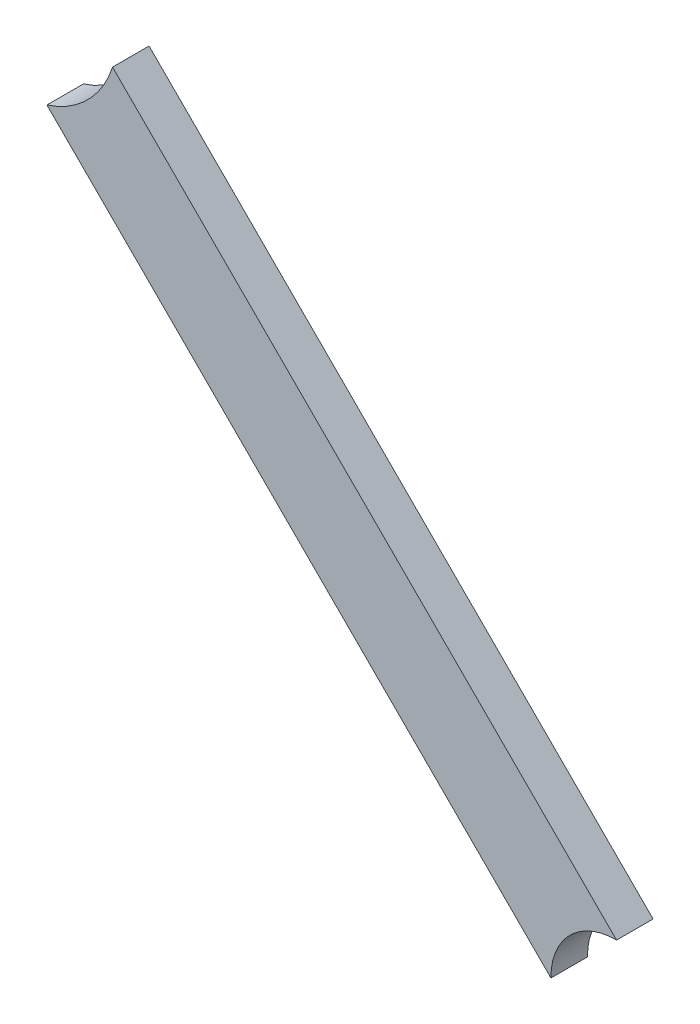
ISO-10303-21;
HEADER;
FILE_DESCRIPTION(('STEP AP214'),'2;1');
FILE_NAME('part.step','',(''),(''),'','','');
FILE_SCHEMA(('AUTOMOTIVE_DESIGN { 1 0 10303 214 1 1 1 1 }'));
ENDSEC;
DATA;
#1=APPLICATION_CONTEXT('core data for automotive mechanical design processes');
#2=APPLICATION_PROTOCOL_DEFINITION('international standard','automotive_design',2000,#1);
#3=PRODUCT_CONTEXT('',#1,'mechanical');
#4=PRODUCT('Part','Part','',(#3));
#5=PRODUCT_RELATED_PRODUCT_CATEGORY('part','',(#4));
#6=PRODUCT_DEFINITION_FORMATION('','',#4);
#7=PRODUCT_DEFINITION_CONTEXT('part definition',#1,'design');
#8=PRODUCT_DEFINITION('design','',#6,#7);
#9=PRODUCT_DEFINITION_SHAPE('','',#8);
#10=(LENGTH_UNIT() NAMED_UNIT(*) SI_UNIT(.MILLI.,.METRE.));
#11=(NAMED_UNIT(*) PLANE_ANGLE_UNIT() SI_UNIT($,.RADIAN.));
#12=(NAMED_UNIT(*) SI_UNIT($,.STERADIAN.) SOLID_ANGLE_UNIT());
#13=UNCERTAINTY_MEASURE_WITH_UNIT(LENGTH_MEASURE(1.E-05),#10,'distance_accuracy_value','');
#14=(GEOMETRIC_REPRESENTATION_CONTEXT(3) GLOBAL_UNCERTAINTY_ASSIGNED_CONTEXT((#13)) GLOBAL_UNIT_ASSIGNED_CONTEXT((#10,
#11,#12)) REPRESENTATION_CONTEXT('',''));
#15=CARTESIAN_POINT('',(0.,0.,0.));
#16=DIRECTION('',(0.,0.,1.));
#17=DIRECTION('',(1.,0.,0.));
#18=AXIS2_PLACEMENT_3D('',#15,#16,#17);
#19=CARTESIAN_POINT('',(113.954062741144,100.690460978856,0.));
#20=DIRECTION('',(0.707106781186549,0.707106781186546,0.));
#21=DIRECTION('',(0.707106781186546,-0.707106781186549,0.));
#22=AXIS2_PLACEMENT_3D('',#19,#20,#21);
#23=PLANE('',#22);
#24=DIRECTION('',(0.707106781186546,-0.707106781186549,0.));
#25=VECTOR('',#24,1.);
#26=CARTESIAN_POINT('',(113.60512966,101.03939406,0.1999996));
#27=LINE('',#26,#25);
#28=CARTESIAN_POINT('',(113.954062741144,100.690460978856,0.1999996));
#29=VERTEX_POINT('',#28);
#30=CARTESIAN_POINT('',(116.713018532393,97.9315051876074,0.1999996));
#31=VERTEX_POINT('',#30);
#32=EDGE_CURVE('E11',#29,#31,#27,.T.);
#33=ORIENTED_EDGE('',*,*,#32,.F.);
#34=DIRECTION('',(0.,0.,1.));
#35=VECTOR('',#34,1.);
#36=CARTESIAN_POINT('',(113.954062741144,100.690460978856,0.));
#37=LINE('',#36,#35);
#38=CARTESIAN_POINT('',(113.954062741144,100.690460978856,0.));
#39=VERTEX_POINT('',#38);
#40=EDGE_CURVE('E24',#39,#29,#37,.T.);
#41=ORIENTED_EDGE('',*,*,#40,.F.);
#42=DIRECTION('',(0.707106781186546,-0.707106781186549,0.));
#43=VECTOR('',#42,1.);
#44=CARTESIAN_POINT('',(113.60512966,101.03939406,0.));
#45=LINE('',#44,#43);
#46=CARTESIAN_POINT('',(116.713018532393,97.9315051876074,0.));
#47=VERTEX_POINT('',#46);
#48=EDGE_CURVE('E75',#39,#47,#45,.T.);
#49=ORIENTED_EDGE('',*,*,#48,.T.);
#50=DIRECTION('',(0.,0.,1.));
#51=VECTOR('',#50,1.);
#52=CARTESIAN_POINT('',(116.713018532393,97.9315051876074,0.));
#53=LINE('',#52,#51);
#54=EDGE_CURVE('E37',#47,#31,#53,.T.);
#55=ORIENTED_EDGE('',*,*,#54,.T.);
#56=EDGE_LOOP('',(#33,#41,#49,#55));
#57=FACE_BOUND('',#56,.T.);
#58=ADVANCED_FACE('F17',(#57),#23,.F.);
#59=CARTESIAN_POINT('',(117.0686,97.9351356,0.));
#60=DIRECTION('',(0.,0.,-1.));
#61=DIRECTION('',(1.,0.,0.));
#62=AXIS2_PLACEMENT_3D('',#59,#60,#61);
#63=CYLINDRICAL_SURFACE('',#62,0.3556);
#64=DIRECTION('',(0.,0.,1.));
#65=VECTOR('',#64,1.);
#66=CARTESIAN_POINT('',(117.072230412393,98.2907170676074,0.));
#67=LINE('',#66,#65);
#68=CARTESIAN_POINT('',(117.072230412393,98.2907170676074,0.));
#69=VERTEX_POINT('',#68);
#70=CARTESIAN_POINT('',(117.072230412393,98.2907170676074,0.1999996));
#71=VERTEX_POINT('',#70);
#72=EDGE_CURVE('E67',#69,#71,#67,.T.);
#73=ORIENTED_EDGE('',*,*,#72,.T.);
#74=CARTESIAN_POINT('',(117.0686,97.9351356,0.1999996));
#75=DIRECTION('',(0.,0.,1.));
#76=DIRECTION('',(1.,0.,0.));
#77=AXIS2_PLACEMENT_3D('',#74,#75,#76);
#78=CIRCLE('',#77,0.3556);
#79=EDGE_CURVE('E82',#71,#31,#78,.T.);
#80=ORIENTED_EDGE('',*,*,#79,.T.);
#81=ORIENTED_EDGE('',*,*,#54,.F.);
#82=CARTESIAN_POINT('',(117.0686,97.9351356,0.));
#83=DIRECTION('',(0.,0.,1.));
#84=DIRECTION('',(1.,0.,0.));
#85=AXIS2_PLACEMENT_3D('',#82,#83,#84);
#86=CIRCLE('',#85,0.3556);
#87=EDGE_CURVE('E80',#69,#47,#86,.T.);
#88=ORIENTED_EDGE('',*,*,#87,.F.);
#89=EDGE_LOOP('',(#73,#80,#81,#88));
#90=FACE_BOUND('',#89,.T.);
#91=ADVANCED_FACE('F88',(#90),#63,.F.);
#92=CARTESIAN_POINT('',(117.072230412393,98.2907170676074,0.));
#93=DIRECTION('',(-0.707106781186549,-0.707106781186546,0.));
#94=DIRECTION('',(-0.707106781186546,0.707106781186549,0.));
#95=AXIS2_PLACEMENT_3D('',#92,#93,#94);
#96=PLANE('',#95);
#97=DIRECTION('',(-0.707106781186546,0.707106781186549,0.));
#98=VECTOR('',#97,1.);
#99=CARTESIAN_POINT('',(117.24820594,98.11474154,0.1999996));
#100=LINE('',#99,#98);
#101=CARTESIAN_POINT('',(114.313274621144,101.049672858856,0.1999996));
#102=VERTEX_POINT('',#101);
#103=EDGE_CURVE('E71',#71,#102,#100,.T.);
#104=ORIENTED_EDGE('',*,*,#103,.F.);
#105=ORIENTED_EDGE('',*,*,#72,.F.);
#106=DIRECTION('',(-0.707106781186546,0.707106781186549,0.));
#107=VECTOR('',#106,1.);
#108=CARTESIAN_POINT('',(117.24820594,98.11474154,0.));
#109=LINE('',#108,#107);
#110=CARTESIAN_POINT('',(114.313274621144,101.049672858856,0.));
#111=VERTEX_POINT('',#110);
#112=EDGE_CURVE('E63',#69,#111,#109,.T.);
#113=ORIENTED_EDGE('',*,*,#112,.T.);
#114=DIRECTION('',(0.,0.,1.));
#115=VECTOR('',#114,1.);
#116=CARTESIAN_POINT('',(114.313274621144,101.049672858856,0.));
#117=LINE('',#116,#115);
#118=EDGE_CURVE('E53',#111,#102,#117,.T.);
#119=ORIENTED_EDGE('',*,*,#118,.T.);
#120=EDGE_LOOP('',(#104,#105,#113,#119));
#121=FACE_BOUND('',#120,.T.);
#122=ADVANCED_FACE('F66',(#121),#96,.F.);
#123=CARTESIAN_POINT('',(113.7847356,101.219,0.));
#124=DIRECTION('',(0.,0.,-1.));
#125=DIRECTION('',(1.,0.,0.));
#126=AXIS2_PLACEMENT_3D('',#123,#124,#125);
#127=CYLINDRICAL_SURFACE('',#126,0.55500016);
#128=ORIENTED_EDGE('',*,*,#40,.T.);
#129=CARTESIAN_POINT('',(113.7847356,101.219,0.1999996));
#130=DIRECTION('',(0.,0.,1.));
#131=DIRECTION('',(1.,0.,0.));
#132=AXIS2_PLACEMENT_3D('',#129,#130,#131);
#133=CIRCLE('',#132,0.55500016);
#134=EDGE_CURVE('E59',#29,#102,#133,.T.);
#135=ORIENTED_EDGE('',*,*,#134,.T.);
#136=ORIENTED_EDGE('',*,*,#118,.F.);
#137=CARTESIAN_POINT('',(113.7847356,101.219,0.));
#138=DIRECTION('',(0.,0.,1.));
#139=DIRECTION('',(1.,0.,0.));
#140=AXIS2_PLACEMENT_3D('',#137,#138,#139);
#141=CIRCLE('',#140,0.55500016);
#142=EDGE_CURVE('E57',#39,#111,#141,.T.);
#143=ORIENTED_EDGE('',*,*,#142,.F.);
#144=EDGE_LOOP('',(#128,#135,#136,#143));
#145=FACE_BOUND('',#144,.T.);
#146=ADVANCED_FACE('F55',(#145),#127,.F.);
#147=CARTESIAN_POINT('',(113.60512966,101.03939406,0.));
#148=DIRECTION('',(0.,0.,-1.));
#149=DIRECTION('',(-1.,0.,0.));
#150=AXIS2_PLACEMENT_3D('',#147,#148,#149);
#151=PLANE('',#150);
#152=ORIENTED_EDGE('',*,*,#48,.F.);
#153=ORIENTED_EDGE('',*,*,#142,.T.);
#154=ORIENTED_EDGE('',*,*,#112,.F.);
#155=ORIENTED_EDGE('',*,*,#87,.T.);
#156=EDGE_LOOP('',(#152,#153,#154,#155));
#157=FACE_BOUND('',#156,.T.);
#158=ADVANCED_FACE('F74',(#157),#151,.T.);
#159=CARTESIAN_POINT('',(113.60512966,101.03939406,0.1999996));
#160=DIRECTION('',(0.,0.,-1.));
#161=DIRECTION('',(-1.,0.,0.));
#162=AXIS2_PLACEMENT_3D('',#159,#160,#161);
#163=PLANE('',#162);
#164=ORIENTED_EDGE('',*,*,#134,.F.);
#165=ORIENTED_EDGE('',*,*,#32,.T.);
#166=ORIENTED_EDGE('',*,*,#79,.F.);
#167=ORIENTED_EDGE('',*,*,#103,.T.);
#168=EDGE_LOOP('',(#164,#165,#166,#167));
#169=FACE_BOUND('',#168,.T.);
#170=ADVANCED_FACE('F91',(#169),#163,.F.);
#171=CLOSED_SHELL('',(#58,#91,#122,#146,#158,#170));
#172=MANIFOLD_SOLID_BREP('B1',#171);
#173=ADVANCED_BREP_SHAPE_REPRESENTATION('',(#18,#172),#14);
#174=SHAPE_DEFINITION_REPRESENTATION(#9,#173);
ENDSEC;
END-ISO-10303-21;
